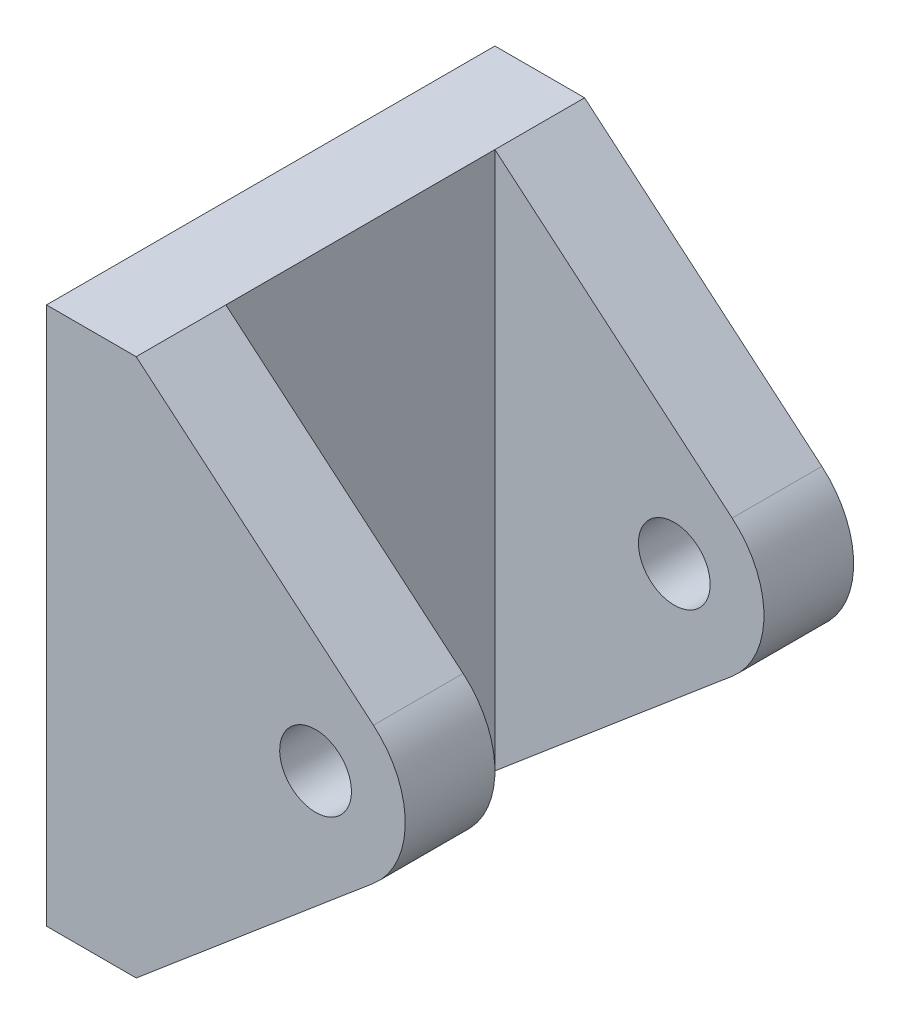
ISO-10303-21;
HEADER;
FILE_DESCRIPTION(('STEP AP214'),'2;1');
FILE_NAME('part.step','',(''),(''),'','','');
FILE_SCHEMA(('AUTOMOTIVE_DESIGN { 1 0 10303 214 1 1 1 1 }'));
ENDSEC;
DATA;
#1=APPLICATION_CONTEXT('core data for automotive mechanical design processes');
#2=APPLICATION_PROTOCOL_DEFINITION('international standard','automotive_design',2000,#1);
#3=PRODUCT_CONTEXT('',#1,'mechanical');
#4=PRODUCT('Part','Part','',(#3));
#5=PRODUCT_RELATED_PRODUCT_CATEGORY('part','',(#4));
#6=PRODUCT_DEFINITION_FORMATION('','',#4);
#7=PRODUCT_DEFINITION_CONTEXT('part definition',#1,'design');
#8=PRODUCT_DEFINITION('design','',#6,#7);
#9=PRODUCT_DEFINITION_SHAPE('','',#8);
#10=(LENGTH_UNIT() NAMED_UNIT(*) SI_UNIT(.MILLI.,.METRE.));
#11=(NAMED_UNIT(*) PLANE_ANGLE_UNIT() SI_UNIT($,.RADIAN.));
#12=(NAMED_UNIT(*) SI_UNIT($,.STERADIAN.) SOLID_ANGLE_UNIT());
#13=UNCERTAINTY_MEASURE_WITH_UNIT(LENGTH_MEASURE(1.E-05),#10,'distance_accuracy_value','');
#14=(GEOMETRIC_REPRESENTATION_CONTEXT(3) GLOBAL_UNCERTAINTY_ASSIGNED_CONTEXT((#13)) GLOBAL_UNIT_ASSIGNED_CONTEXT((#10,
#11,#12)) REPRESENTATION_CONTEXT('',''));
#15=CARTESIAN_POINT('',(0.,0.,0.));
#16=DIRECTION('',(0.,0.,1.));
#17=DIRECTION('',(1.,0.,0.));
#18=AXIS2_PLACEMENT_3D('',#15,#16,#17);
#19=CARTESIAN_POINT('',(6.45561911185635,-7.63707940790423,50.));
#20=DIRECTION('',(-0.645561911185636,0.763707940790424,0.));
#21=DIRECTION('',(-0.763707940790424,-0.645561911185636,0.));
#22=AXIS2_PLACEMENT_3D('',#19,#20,#21);
#23=PLANE('',#22);
#24=DIRECTION('',(0.763707940790424,0.645561911185636,0.));
#25=VECTOR('',#24,1.);
#26=CARTESIAN_POINT('',(6.45561911185635,-7.63707940790423,9.99999999999999));
#27=LINE('',#26,#25);
#28=CARTESIAN_POINT('',(-20.,-30.,10.));
#29=VERTEX_POINT('',#28);
#30=CARTESIAN_POINT('',(6.45561911185635,-7.63707940790424,9.99999999999999));
#31=VERTEX_POINT('',#30);
#32=EDGE_CURVE('E142',#29,#31,#27,.T.);
#33=ORIENTED_EDGE('',*,*,#32,.F.);
#34=DIRECTION('',(0.,0.,-1.));
#35=VECTOR('',#34,1.);
#36=CARTESIAN_POINT('',(-20.,-30.,50.));
#37=LINE('',#36,#35);
#38=CARTESIAN_POINT('',(-20.,-30.,0.));
#39=VERTEX_POINT('',#38);
#40=EDGE_CURVE('E89',#29,#39,#37,.T.);
#41=ORIENTED_EDGE('',*,*,#40,.T.);
#42=DIRECTION('',(0.763707940790424,0.645561911185636,0.));
#43=VECTOR('',#42,1.);
#44=CARTESIAN_POINT('',(6.45561911185635,-7.63707940790423,0.));
#45=LINE('',#44,#43);
#46=CARTESIAN_POINT('',(6.45561911185635,-7.63707940790424,0.));
#47=VERTEX_POINT('',#46);
#48=EDGE_CURVE('E139',#39,#47,#45,.T.);
#49=ORIENTED_EDGE('',*,*,#48,.T.);
#50=DIRECTION('',(0.,0.,-1.));
#51=VECTOR('',#50,1.);
#52=CARTESIAN_POINT('',(6.45561911185635,-7.63707940790424,50.));
#53=LINE('',#52,#51);
#54=EDGE_CURVE('E44',#31,#47,#53,.T.);
#55=ORIENTED_EDGE('',*,*,#54,.F.);
#56=EDGE_LOOP('',(#33,#41,#49,#55));
#57=FACE_BOUND('',#56,.T.);
#58=ADVANCED_FACE('F36',(#57),#23,.F.);
#59=DIRECTION('',(-0.763707940790424,-0.645561911185636,0.));
#60=VECTOR('',#59,1.);
#61=CARTESIAN_POINT('',(6.45561911185635,-7.63707940790423,40.));
#62=LINE('',#61,#60);
#63=CARTESIAN_POINT('',(6.45561911185635,-7.63707940790424,40.));
#64=VERTEX_POINT('',#63);
#65=CARTESIAN_POINT('',(-20.,-30.,40.));
#66=VERTEX_POINT('',#65);
#67=EDGE_CURVE('E185',#64,#66,#62,.T.);
#68=ORIENTED_EDGE('',*,*,#67,.F.);
#69=CARTESIAN_POINT('',(6.45561911185635,-7.63707940790424,50.));
#70=VERTEX_POINT('',#69);
#71=EDGE_CURVE('E11',#70,#64,#53,.T.);
#72=ORIENTED_EDGE('',*,*,#71,.F.);
#73=DIRECTION('',(0.763707940790424,0.645561911185636,0.));
#74=VECTOR('',#73,1.);
#75=CARTESIAN_POINT('',(6.45561911185635,-7.63707940790423,50.));
#76=LINE('',#75,#74);
#77=CARTESIAN_POINT('',(-20.,-30.,50.));
#78=VERTEX_POINT('',#77);
#79=EDGE_CURVE('E156',#78,#70,#76,.T.);
#80=ORIENTED_EDGE('',*,*,#79,.F.);
#81=EDGE_CURVE('E157',#78,#66,#37,.T.);
#82=ORIENTED_EDGE('',*,*,#81,.T.);
#83=EDGE_LOOP('',(#68,#72,#80,#82));
#84=FACE_BOUND('',#83,.T.);
#85=ADVANCED_FACE('F245',(#84),#23,.F.);
#86=CARTESIAN_POINT('',(0.,0.,50.));
#87=DIRECTION('',(0.,0.,-1.));
#88=DIRECTION('',(-1.,0.,0.));
#89=AXIS2_PLACEMENT_3D('',#86,#87,#88);
#90=CYLINDRICAL_SURFACE('',#89,10.);
#91=CARTESIAN_POINT('',(0.,0.,9.99999999999999));
#92=DIRECTION('',(0.,0.,1.));
#93=DIRECTION('',(1.,0.,0.));
#94=AXIS2_PLACEMENT_3D('',#91,#92,#93);
#95=CIRCLE('',#94,10.);
#96=CARTESIAN_POINT('',(6.45561911185635,7.63707940790422,9.99999999999999));
#97=VERTEX_POINT('',#96);
#98=EDGE_CURVE('E190',#31,#97,#95,.T.);
#99=ORIENTED_EDGE('',*,*,#98,.F.);
#100=ORIENTED_EDGE('',*,*,#54,.T.);
#101=CARTESIAN_POINT('',(0.,0.,0.));
#102=DIRECTION('',(0.,0.,1.));
#103=DIRECTION('',(1.,0.,0.));
#104=AXIS2_PLACEMENT_3D('',#101,#102,#103);
#105=CIRCLE('',#104,10.);
#106=CARTESIAN_POINT('',(6.45561911185635,7.63707940790423,0.));
#107=VERTEX_POINT('',#106);
#108=EDGE_CURVE('E141',#47,#107,#105,.T.);
#109=ORIENTED_EDGE('',*,*,#108,.T.);
#110=DIRECTION('',(0.,0.,-1.));
#111=VECTOR('',#110,1.);
#112=CARTESIAN_POINT('',(6.45561911185635,7.63707940790423,50.));
#113=LINE('',#112,#111);
#114=EDGE_CURVE('E163',#97,#107,#113,.T.);
#115=ORIENTED_EDGE('',*,*,#114,.F.);
#116=EDGE_LOOP('',(#99,#100,#109,#115));
#117=FACE_BOUND('',#116,.T.);
#118=ADVANCED_FACE('F223',(#117),#90,.T.);
#119=CARTESIAN_POINT('',(0.,0.,40.));
#120=DIRECTION('',(0.,0.,-1.));
#121=DIRECTION('',(0.,1.,0.));
#122=AXIS2_PLACEMENT_3D('',#119,#120,#121);
#123=CIRCLE('',#122,10.);
#124=CARTESIAN_POINT('',(6.45561911185635,7.63707940790422,40.));
#125=VERTEX_POINT('',#124);
#126=EDGE_CURVE('E173',#125,#64,#123,.T.);
#127=ORIENTED_EDGE('',*,*,#126,.F.);
#128=CARTESIAN_POINT('',(6.45561911185635,7.63707940790423,50.));
#129=VERTEX_POINT('',#128);
#130=EDGE_CURVE('E164',#129,#125,#113,.T.);
#131=ORIENTED_EDGE('',*,*,#130,.F.);
#132=CARTESIAN_POINT('',(0.,0.,50.));
#133=DIRECTION('',(0.,0.,1.));
#134=DIRECTION('',(1.,0.,0.));
#135=AXIS2_PLACEMENT_3D('',#132,#133,#134);
#136=CIRCLE('',#135,10.);
#137=EDGE_CURVE('E97',#70,#129,#136,.T.);
#138=ORIENTED_EDGE('',*,*,#137,.F.);
#139=ORIENTED_EDGE('',*,*,#71,.T.);
#140=EDGE_LOOP('',(#127,#131,#138,#139));
#141=FACE_BOUND('',#140,.T.);
#142=ADVANCED_FACE('F198',(#141),#90,.T.);
#143=CARTESIAN_POINT('',(6.45561911185635,7.63707940790423,50.));
#144=DIRECTION('',(0.645561911185636,0.763707940790424,0.));
#145=DIRECTION('',(-0.763707940790424,0.645561911185636,0.));
#146=AXIS2_PLACEMENT_3D('',#143,#144,#145);
#147=PLANE('',#146);
#148=DIRECTION('',(0.,0.,-1.));
#149=VECTOR('',#148,1.);
#150=CARTESIAN_POINT('',(-20.,30.,50.));
#151=LINE('',#150,#149);
#152=CARTESIAN_POINT('',(-20.,30.,10.));
#153=VERTEX_POINT('',#152);
#154=CARTESIAN_POINT('',(-20.,30.,0.));
#155=VERTEX_POINT('',#154);
#156=EDGE_CURVE('E118',#153,#155,#151,.T.);
#157=ORIENTED_EDGE('',*,*,#156,.F.);
#158=DIRECTION('',(0.763707940790424,-0.645561911185636,0.));
#159=VECTOR('',#158,1.);
#160=CARTESIAN_POINT('',(6.45561911185635,7.63707940790423,9.99999999999999));
#161=LINE('',#160,#159);
#162=EDGE_CURVE('E187',#153,#97,#161,.T.);
#163=ORIENTED_EDGE('',*,*,#162,.T.);
#164=ORIENTED_EDGE('',*,*,#114,.T.);
#165=DIRECTION('',(0.763707940790424,-0.645561911185636,0.));
#166=VECTOR('',#165,1.);
#167=CARTESIAN_POINT('',(6.45561911185635,7.63707940790423,0.));
#168=LINE('',#167,#166);
#169=EDGE_CURVE('E145',#155,#107,#168,.T.);
#170=ORIENTED_EDGE('',*,*,#169,.F.);
#171=EDGE_LOOP('',(#157,#163,#164,#170));
#172=FACE_BOUND('',#171,.T.);
#173=ADVANCED_FACE('F233',(#172),#147,.T.);
#174=ORIENTED_EDGE('',*,*,#130,.T.);
#175=DIRECTION('',(-0.763707940790424,0.645561911185636,0.));
#176=VECTOR('',#175,1.);
#177=CARTESIAN_POINT('',(6.45561911185635,7.63707940790423,40.));
#178=LINE('',#177,#176);
#179=CARTESIAN_POINT('',(-20.,30.,40.));
#180=VERTEX_POINT('',#179);
#181=EDGE_CURVE('E168',#125,#180,#178,.T.);
#182=ORIENTED_EDGE('',*,*,#181,.T.);
#183=CARTESIAN_POINT('',(-20.,30.,50.));
#184=VERTEX_POINT('',#183);
#185=EDGE_CURVE('E161',#184,#180,#151,.T.);
#186=ORIENTED_EDGE('',*,*,#185,.F.);
#187=DIRECTION('',(0.763707940790424,-0.645561911185636,0.));
#188=VECTOR('',#187,1.);
#189=CARTESIAN_POINT('',(6.45561911185635,7.63707940790423,50.));
#190=LINE('',#189,#188);
#191=EDGE_CURVE('E130',#184,#129,#190,.T.);
#192=ORIENTED_EDGE('',*,*,#191,.T.);
#193=EDGE_LOOP('',(#174,#182,#186,#192));
#194=FACE_BOUND('',#193,.T.);
#195=ADVANCED_FACE('F201',(#194),#147,.T.);
#196=CARTESIAN_POINT('',(0.,0.,50.));
#197=DIRECTION('',(0.,0.,-1.));
#198=DIRECTION('',(-1.,0.,0.));
#199=AXIS2_PLACEMENT_3D('',#196,#197,#198);
#200=CYLINDRICAL_SURFACE('',#199,4.);
#201=CARTESIAN_POINT('',(0.,0.,0.));
#202=DIRECTION('',(0.,0.,1.));
#203=DIRECTION('',(1.,0.,0.));
#204=AXIS2_PLACEMENT_3D('',#201,#202,#203);
#205=CIRCLE('',#204,4.);
#206=CARTESIAN_POINT('',(4.,0.,0.));
#207=VERTEX_POINT('',#206);
#208=EDGE_CURVE('E153',#207,#207,#205,.T.);
#209=ORIENTED_EDGE('',*,*,#208,.F.);
#210=EDGE_LOOP('',(#209));
#211=FACE_BOUND('',#210,.T.);
#212=CARTESIAN_POINT('',(0.,0.,9.99999999999999));
#213=DIRECTION('',(0.,0.,1.));
#214=DIRECTION('',(1.,0.,0.));
#215=AXIS2_PLACEMENT_3D('',#212,#213,#214);
#216=CIRCLE('',#215,4.);
#217=CARTESIAN_POINT('',(4.,0.,9.99999999999999));
#218=VERTEX_POINT('',#217);
#219=EDGE_CURVE('E39',#218,#218,#216,.T.);
#220=ORIENTED_EDGE('',*,*,#219,.T.);
#221=EDGE_LOOP('',(#220));
#222=FACE_BOUND('',#221,.T.);
#223=ADVANCED_FACE('F265',(#211,#222),#200,.F.);
#224=CARTESIAN_POINT('',(0.,0.,50.));
#225=DIRECTION('',(0.,0.,1.));
#226=DIRECTION('',(1.,0.,0.));
#227=AXIS2_PLACEMENT_3D('',#224,#225,#226);
#228=CIRCLE('',#227,4.);
#229=CARTESIAN_POINT('',(4.,0.,50.));
#230=VERTEX_POINT('',#229);
#231=EDGE_CURVE('E136',#230,#230,#228,.T.);
#232=ORIENTED_EDGE('',*,*,#231,.T.);
#233=EDGE_LOOP('',(#232));
#234=FACE_BOUND('',#233,.T.);
#235=CARTESIAN_POINT('',(0.,0.,40.));
#236=DIRECTION('',(0.,0.,-1.));
#237=DIRECTION('',(0.,1.,0.));
#238=AXIS2_PLACEMENT_3D('',#235,#236,#237);
#239=CIRCLE('',#238,4.);
#240=CARTESIAN_POINT('',(0.,4.,40.));
#241=VERTEX_POINT('',#240);
#242=EDGE_CURVE('E166',#241,#241,#239,.T.);
#243=ORIENTED_EDGE('',*,*,#242,.T.);
#244=EDGE_LOOP('',(#243));
#245=FACE_BOUND('',#244,.T.);
#246=ADVANCED_FACE('F270',(#234,#245),#200,.F.);
#247=CARTESIAN_POINT('',(0.,30.,50.));
#248=DIRECTION('',(0.,1.,0.));
#249=DIRECTION('',(0.,0.,1.));
#250=AXIS2_PLACEMENT_3D('',#247,#248,#249);
#251=PLANE('',#250);
#252=DIRECTION('',(1.,0.,0.));
#253=VECTOR('',#252,1.);
#254=CARTESIAN_POINT('',(0.,30.,0.));
#255=LINE('',#254,#253);
#256=CARTESIAN_POINT('',(-30.,30.,0.));
#257=VERTEX_POINT('',#256);
#258=EDGE_CURVE('E115',#257,#155,#255,.T.);
#259=ORIENTED_EDGE('',*,*,#258,.F.);
#260=DIRECTION('',(0.,0.,-1.));
#261=VECTOR('',#260,1.);
#262=CARTESIAN_POINT('',(-30.,30.,50.));
#263=LINE('',#262,#261);
#264=CARTESIAN_POINT('',(-30.,30.,50.));
#265=VERTEX_POINT('',#264);
#266=EDGE_CURVE('E108',#265,#257,#263,.T.);
#267=ORIENTED_EDGE('',*,*,#266,.F.);
#268=DIRECTION('',(1.,0.,0.));
#269=VECTOR('',#268,1.);
#270=CARTESIAN_POINT('',(0.,30.,50.));
#271=LINE('',#270,#269);
#272=EDGE_CURVE('E113',#265,#184,#271,.T.);
#273=ORIENTED_EDGE('',*,*,#272,.T.);
#274=ORIENTED_EDGE('',*,*,#185,.T.);
#275=DIRECTION('',(0.,0.,1.));
#276=VECTOR('',#275,1.);
#277=CARTESIAN_POINT('',(-20.,30.,40.));
#278=LINE('',#277,#276);
#279=EDGE_CURVE('E179',#153,#180,#278,.T.);
#280=ORIENTED_EDGE('',*,*,#279,.F.);
#281=ORIENTED_EDGE('',*,*,#156,.T.);
#282=EDGE_LOOP('',(#259,#267,#273,#274,#280,#281));
#283=FACE_BOUND('',#282,.T.);
#284=ADVANCED_FACE('F110',(#283),#251,.T.);
#285=CARTESIAN_POINT('',(-30.,0.,50.));
#286=DIRECTION('',(1.,0.,0.));
#287=DIRECTION('',(0.,1.,0.));
#288=AXIS2_PLACEMENT_3D('',#285,#286,#287);
#289=PLANE('',#288);
#290=DIRECTION('',(0.,-1.,0.));
#291=VECTOR('',#290,1.);
#292=CARTESIAN_POINT('',(-30.,0.,0.));
#293=LINE('',#292,#291);
#294=CARTESIAN_POINT('',(-30.,-30.,0.));
#295=VERTEX_POINT('',#294);
#296=EDGE_CURVE('E149',#257,#295,#293,.T.);
#297=ORIENTED_EDGE('',*,*,#296,.T.);
#298=DIRECTION('',(0.,0.,-1.));
#299=VECTOR('',#298,1.);
#300=CARTESIAN_POINT('',(-30.,-30.,50.));
#301=LINE('',#300,#299);
#302=CARTESIAN_POINT('',(-30.,-30.,50.));
#303=VERTEX_POINT('',#302);
#304=EDGE_CURVE('E119',#303,#295,#301,.T.);
#305=ORIENTED_EDGE('',*,*,#304,.F.);
#306=DIRECTION('',(0.,-1.,0.));
#307=VECTOR('',#306,1.);
#308=CARTESIAN_POINT('',(-30.,0.,50.));
#309=LINE('',#308,#307);
#310=EDGE_CURVE('E122',#265,#303,#309,.T.);
#311=ORIENTED_EDGE('',*,*,#310,.F.);
#312=ORIENTED_EDGE('',*,*,#266,.T.);
#313=EDGE_LOOP('',(#297,#305,#311,#312));
#314=FACE_BOUND('',#313,.T.);
#315=ADVANCED_FACE('F123',(#314),#289,.F.);
#316=CARTESIAN_POINT('',(0.,-30.,50.));
#317=DIRECTION('',(0.,1.,0.));
#318=DIRECTION('',(0.,0.,1.));
#319=AXIS2_PLACEMENT_3D('',#316,#317,#318);
#320=PLANE('',#319);
#321=DIRECTION('',(1.,0.,0.));
#322=VECTOR('',#321,1.);
#323=CARTESIAN_POINT('',(0.,-30.,0.));
#324=LINE('',#323,#322);
#325=EDGE_CURVE('E151',#295,#39,#324,.T.);
#326=ORIENTED_EDGE('',*,*,#325,.T.);
#327=ORIENTED_EDGE('',*,*,#40,.F.);
#328=DIRECTION('',(0.,0.,-1.));
#329=VECTOR('',#328,1.);
#330=CARTESIAN_POINT('',(-20.,-30.,40.));
#331=LINE('',#330,#329);
#332=EDGE_CURVE('E169',#66,#29,#331,.T.);
#333=ORIENTED_EDGE('',*,*,#332,.F.);
#334=ORIENTED_EDGE('',*,*,#81,.F.);
#335=DIRECTION('',(1.,0.,0.));
#336=VECTOR('',#335,1.);
#337=CARTESIAN_POINT('',(0.,-30.,50.));
#338=LINE('',#337,#336);
#339=EDGE_CURVE('E61',#303,#78,#338,.T.);
#340=ORIENTED_EDGE('',*,*,#339,.F.);
#341=ORIENTED_EDGE('',*,*,#304,.T.);
#342=EDGE_LOOP('',(#326,#327,#333,#334,#340,#341));
#343=FACE_BOUND('',#342,.T.);
#344=ADVANCED_FACE('F255',(#343),#320,.F.);
#345=CARTESIAN_POINT('',(0.,0.,50.));
#346=DIRECTION('',(0.,0.,1.));
#347=DIRECTION('',(1.,0.,0.));
#348=AXIS2_PLACEMENT_3D('',#345,#346,#347);
#349=PLANE('',#348);
#350=ORIENTED_EDGE('',*,*,#79,.T.);
#351=ORIENTED_EDGE('',*,*,#137,.T.);
#352=ORIENTED_EDGE('',*,*,#191,.F.);
#353=ORIENTED_EDGE('',*,*,#272,.F.);
#354=ORIENTED_EDGE('',*,*,#310,.T.);
#355=ORIENTED_EDGE('',*,*,#339,.T.);
#356=EDGE_LOOP('',(#350,#351,#352,#353,#354,#355));
#357=FACE_BOUND('',#356,.T.);
#358=ORIENTED_EDGE('',*,*,#231,.F.);
#359=EDGE_LOOP('',(#358));
#360=FACE_BOUND('',#359,.T.);
#361=ADVANCED_FACE('F127',(#357,#360),#349,.T.);
#362=CARTESIAN_POINT('',(0.,0.,0.));
#363=DIRECTION('',(0.,0.,1.));
#364=DIRECTION('',(1.,0.,0.));
#365=AXIS2_PLACEMENT_3D('',#362,#363,#364);
#366=PLANE('',#365);
#367=ORIENTED_EDGE('',*,*,#48,.F.);
#368=ORIENTED_EDGE('',*,*,#325,.F.);
#369=ORIENTED_EDGE('',*,*,#296,.F.);
#370=ORIENTED_EDGE('',*,*,#258,.T.);
#371=ORIENTED_EDGE('',*,*,#169,.T.);
#372=ORIENTED_EDGE('',*,*,#108,.F.);
#373=EDGE_LOOP('',(#367,#368,#369,#370,#371,#372));
#374=FACE_BOUND('',#373,.T.);
#375=ORIENTED_EDGE('',*,*,#208,.T.);
#376=EDGE_LOOP('',(#375));
#377=FACE_BOUND('',#376,.T.);
#378=ADVANCED_FACE('F228',(#374,#377),#366,.F.);
#379=CARTESIAN_POINT('',(40.,30.,10.));
#380=DIRECTION('',(0.,0.,1.));
#381=DIRECTION('',(1.,0.,0.));
#382=AXIS2_PLACEMENT_3D('',#379,#380,#381);
#383=PLANE('',#382);
#384=ORIENTED_EDGE('',*,*,#219,.F.);
#385=EDGE_LOOP('',(#384));
#386=FACE_BOUND('',#385,.T.);
#387=ORIENTED_EDGE('',*,*,#32,.T.);
#388=ORIENTED_EDGE('',*,*,#98,.T.);
#389=ORIENTED_EDGE('',*,*,#162,.F.);
#390=DIRECTION('',(0.,1.,0.));
#391=VECTOR('',#390,1.);
#392=CARTESIAN_POINT('',(-20.,30.,10.));
#393=LINE('',#392,#391);
#394=EDGE_CURVE('E219',#29,#153,#393,.T.);
#395=ORIENTED_EDGE('',*,*,#394,.F.);
#396=EDGE_LOOP('',(#387,#388,#389,#395));
#397=FACE_BOUND('',#396,.T.);
#398=ADVANCED_FACE('F218',(#386,#397),#383,.T.);
#399=CARTESIAN_POINT('',(40.,30.,40.));
#400=DIRECTION('',(0.,0.,-1.));
#401=DIRECTION('',(0.,1.,0.));
#402=AXIS2_PLACEMENT_3D('',#399,#400,#401);
#403=PLANE('',#402);
#404=ORIENTED_EDGE('',*,*,#242,.F.);
#405=EDGE_LOOP('',(#404));
#406=FACE_BOUND('',#405,.T.);
#407=ORIENTED_EDGE('',*,*,#67,.T.);
#408=DIRECTION('',(0.,-1.,0.));
#409=VECTOR('',#408,1.);
#410=CARTESIAN_POINT('',(-20.,30.,40.));
#411=LINE('',#410,#409);
#412=EDGE_CURVE('E52',#180,#66,#411,.T.);
#413=ORIENTED_EDGE('',*,*,#412,.F.);
#414=ORIENTED_EDGE('',*,*,#181,.F.);
#415=ORIENTED_EDGE('',*,*,#126,.T.);
#416=EDGE_LOOP('',(#407,#413,#414,#415));
#417=FACE_BOUND('',#416,.T.);
#418=ADVANCED_FACE('F237',(#406,#417),#403,.T.);
#419=CARTESIAN_POINT('',(-20.,0.,0.));
#420=DIRECTION('',(1.,0.,0.));
#421=DIRECTION('',(0.,0.,-1.));
#422=AXIS2_PLACEMENT_3D('',#419,#420,#421);
#423=PLANE('',#422);
#424=ORIENTED_EDGE('',*,*,#394,.T.);
#425=ORIENTED_EDGE('',*,*,#279,.T.);
#426=ORIENTED_EDGE('',*,*,#412,.T.);
#427=ORIENTED_EDGE('',*,*,#332,.T.);
#428=EDGE_LOOP('',(#424,#425,#426,#427));
#429=FACE_BOUND('',#428,.T.);
#430=ADVANCED_FACE('F234',(#429),#423,.T.);
#431=CLOSED_SHELL('',(#58,#85,#118,#142,#173,#195,#223,#246,#284,#315,#344,#361,#378,#398,#418,#430));
#432=MANIFOLD_SOLID_BREP('B2',#431);
#433=ADVANCED_BREP_SHAPE_REPRESENTATION('',(#18,#432),#14);
#434=SHAPE_DEFINITION_REPRESENTATION(#9,#433);
ENDSEC;
END-ISO-10303-21;
